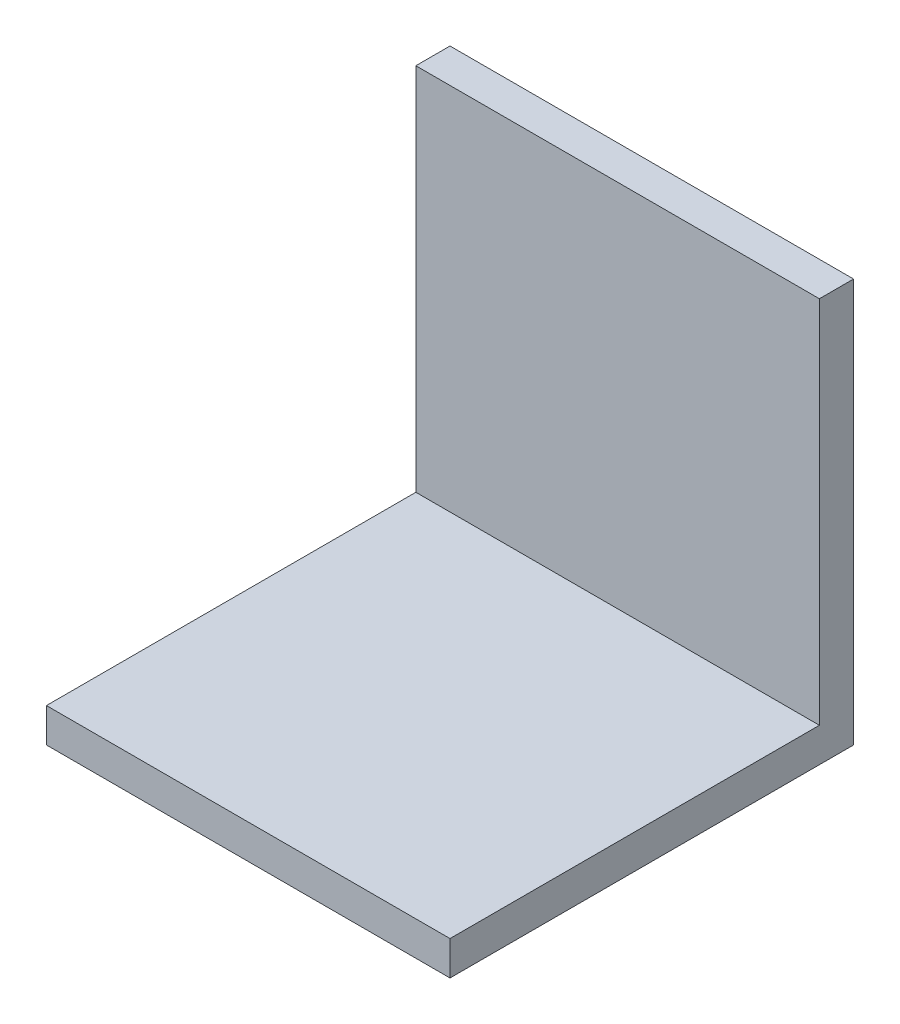
ISO-10303-21;
HEADER;
FILE_DESCRIPTION(('STEP AP214'),'2;1');
FILE_NAME('part.step','',(''),(''),'','','');
FILE_SCHEMA(('AUTOMOTIVE_DESIGN { 1 0 10303 214 1 1 1 1 }'));
ENDSEC;
DATA;
#1=APPLICATION_CONTEXT('core data for automotive mechanical design processes');
#2=APPLICATION_PROTOCOL_DEFINITION('international standard','automotive_design',2000,#1);
#3=PRODUCT_CONTEXT('',#1,'mechanical');
#4=PRODUCT('Part','Part','',(#3));
#5=PRODUCT_RELATED_PRODUCT_CATEGORY('part','',(#4));
#6=PRODUCT_DEFINITION_FORMATION('','',#4);
#7=PRODUCT_DEFINITION_CONTEXT('part definition',#1,'design');
#8=PRODUCT_DEFINITION('design','',#6,#7);
#9=PRODUCT_DEFINITION_SHAPE('','',#8);
#10=(LENGTH_UNIT() NAMED_UNIT(*) SI_UNIT(.MILLI.,.METRE.));
#11=(NAMED_UNIT(*) PLANE_ANGLE_UNIT() SI_UNIT($,.RADIAN.));
#12=(NAMED_UNIT(*) SI_UNIT($,.STERADIAN.) SOLID_ANGLE_UNIT());
#13=UNCERTAINTY_MEASURE_WITH_UNIT(LENGTH_MEASURE(1.E-05),#10,'distance_accuracy_value','');
#14=(GEOMETRIC_REPRESENTATION_CONTEXT(3) GLOBAL_UNCERTAINTY_ASSIGNED_CONTEXT((#13)) GLOBAL_UNIT_ASSIGNED_CONTEXT((#10,
#11,#12)) REPRESENTATION_CONTEXT('',''));
#15=CARTESIAN_POINT('',(0.,0.,0.));
#16=DIRECTION('',(0.,0.,1.));
#17=DIRECTION('',(1.,0.,0.));
#18=AXIS2_PLACEMENT_3D('',#15,#16,#17);
#19=CARTESIAN_POINT('',(0.,5.08,0.));
#20=DIRECTION('',(1.,0.,0.));
#21=DIRECTION('',(0.,0.,-1.));
#22=AXIS2_PLACEMENT_3D('',#19,#20,#21);
#23=PLANE('',#22);
#24=DIRECTION('',(0.,0.,1.));
#25=VECTOR('',#24,1.);
#26=CARTESIAN_POINT('',(0.,5.08,0.));
#27=LINE('',#26,#25);
#28=CARTESIAN_POINT('',(0.,5.08,-54.92));
#29=VERTEX_POINT('',#28);
#30=CARTESIAN_POINT('',(0.,5.08,0.));
#31=VERTEX_POINT('',#30);
#32=EDGE_CURVE('E97',#29,#31,#27,.T.);
#33=ORIENTED_EDGE('',*,*,#32,.F.);
#34=DIRECTION('',(0.,1.,0.));
#35=VECTOR('',#34,1.);
#36=CARTESIAN_POINT('',(0.,0.,-54.92));
#37=LINE('',#36,#35);
#38=CARTESIAN_POINT('',(0.,60.,-54.92));
#39=VERTEX_POINT('',#38);
#40=EDGE_CURVE('E91',#29,#39,#37,.T.);
#41=ORIENTED_EDGE('',*,*,#40,.T.);
#42=DIRECTION('',(0.,0.,-1.));
#43=VECTOR('',#42,1.);
#44=CARTESIAN_POINT('',(0.,60.,-54.92));
#45=LINE('',#44,#43);
#46=CARTESIAN_POINT('',(0.,60.,-60.));
#47=VERTEX_POINT('',#46);
#48=EDGE_CURVE('E94',#39,#47,#45,.T.);
#49=ORIENTED_EDGE('',*,*,#48,.T.);
#50=DIRECTION('',(0.,-1.,0.));
#51=VECTOR('',#50,1.);
#52=CARTESIAN_POINT('',(0.,5.08,-60.));
#53=LINE('',#52,#51);
#54=CARTESIAN_POINT('',(0.,0.,-60.));
#55=VERTEX_POINT('',#54);
#56=EDGE_CURVE('E126',#47,#55,#53,.T.);
#57=ORIENTED_EDGE('',*,*,#56,.T.);
#58=DIRECTION('',(0.,0.,1.));
#59=VECTOR('',#58,1.);
#60=CARTESIAN_POINT('',(0.,0.,0.));
#61=LINE('',#60,#59);
#62=CARTESIAN_POINT('',(0.,0.,0.));
#63=VERTEX_POINT('',#62);
#64=EDGE_CURVE('E120',#55,#63,#61,.T.);
#65=ORIENTED_EDGE('',*,*,#64,.T.);
#66=DIRECTION('',(0.,-1.,0.));
#67=VECTOR('',#66,1.);
#68=CARTESIAN_POINT('',(0.,5.08,0.));
#69=LINE('',#68,#67);
#70=EDGE_CURVE('E11',#31,#63,#69,.T.);
#71=ORIENTED_EDGE('',*,*,#70,.F.);
#72=EDGE_LOOP('',(#33,#41,#49,#57,#65,#71));
#73=FACE_BOUND('',#72,.T.);
#74=ADVANCED_FACE('F41',(#73),#23,.F.);
#75=CARTESIAN_POINT('',(0.,5.08,0.));
#76=DIRECTION('',(0.,0.,-1.));
#77=DIRECTION('',(-1.,0.,0.));
#78=AXIS2_PLACEMENT_3D('',#75,#76,#77);
#79=PLANE('',#78);
#80=DIRECTION('',(1.,0.,0.));
#81=VECTOR('',#80,1.);
#82=CARTESIAN_POINT('',(0.,0.,0.));
#83=LINE('',#82,#81);
#84=CARTESIAN_POINT('',(60.,0.,0.));
#85=VERTEX_POINT('',#84);
#86=EDGE_CURVE('E128',#63,#85,#83,.T.);
#87=ORIENTED_EDGE('',*,*,#86,.T.);
#88=DIRECTION('',(0.,-1.,0.));
#89=VECTOR('',#88,1.);
#90=CARTESIAN_POINT('',(60.,5.08,0.));
#91=LINE('',#90,#89);
#92=CARTESIAN_POINT('',(60.,5.08,0.));
#93=VERTEX_POINT('',#92);
#94=EDGE_CURVE('E48',#93,#85,#91,.T.);
#95=ORIENTED_EDGE('',*,*,#94,.F.);
#96=DIRECTION('',(1.,0.,0.));
#97=VECTOR('',#96,1.);
#98=CARTESIAN_POINT('',(0.,5.08,0.));
#99=LINE('',#98,#97);
#100=EDGE_CURVE('E122',#31,#93,#99,.T.);
#101=ORIENTED_EDGE('',*,*,#100,.F.);
#102=ORIENTED_EDGE('',*,*,#70,.T.);
#103=EDGE_LOOP('',(#87,#95,#101,#102));
#104=FACE_BOUND('',#103,.T.);
#105=ADVANCED_FACE('F150',(#104),#79,.F.);
#106=CARTESIAN_POINT('',(60.,5.08,0.));
#107=DIRECTION('',(-1.,0.,0.));
#108=DIRECTION('',(0.,0.,1.));
#109=AXIS2_PLACEMENT_3D('',#106,#107,#108);
#110=PLANE('',#109);
#111=DIRECTION('',(0.,0.,-1.));
#112=VECTOR('',#111,1.);
#113=CARTESIAN_POINT('',(60.,0.,0.));
#114=LINE('',#113,#112);
#115=CARTESIAN_POINT('',(60.,0.,-60.));
#116=VERTEX_POINT('',#115);
#117=EDGE_CURVE('E130',#85,#116,#114,.T.);
#118=ORIENTED_EDGE('',*,*,#117,.T.);
#119=DIRECTION('',(0.,-1.,0.));
#120=VECTOR('',#119,1.);
#121=CARTESIAN_POINT('',(60.,5.08,-60.));
#122=LINE('',#121,#120);
#123=CARTESIAN_POINT('',(60.,60.,-60.));
#124=VERTEX_POINT('',#123);
#125=EDGE_CURVE('E134',#124,#116,#122,.T.);
#126=ORIENTED_EDGE('',*,*,#125,.F.);
#127=DIRECTION('',(0.,0.,-1.));
#128=VECTOR('',#127,1.);
#129=CARTESIAN_POINT('',(60.,60.,-54.92));
#130=LINE('',#129,#128);
#131=CARTESIAN_POINT('',(60.,60.,-54.92));
#132=VERTEX_POINT('',#131);
#133=EDGE_CURVE('E109',#132,#124,#130,.T.);
#134=ORIENTED_EDGE('',*,*,#133,.F.);
#135=DIRECTION('',(0.,-1.,0.));
#136=VECTOR('',#135,1.);
#137=CARTESIAN_POINT('',(60.,0.,-54.92));
#138=LINE('',#137,#136);
#139=CARTESIAN_POINT('',(60.,5.08,-54.92));
#140=VERTEX_POINT('',#139);
#141=EDGE_CURVE('E101',#132,#140,#138,.T.);
#142=ORIENTED_EDGE('',*,*,#141,.T.);
#143=DIRECTION('',(0.,0.,-1.));
#144=VECTOR('',#143,1.);
#145=CARTESIAN_POINT('',(60.,5.08,0.));
#146=LINE('',#145,#144);
#147=EDGE_CURVE('E55',#93,#140,#146,.T.);
#148=ORIENTED_EDGE('',*,*,#147,.F.);
#149=ORIENTED_EDGE('',*,*,#94,.T.);
#150=EDGE_LOOP('',(#118,#126,#134,#142,#148,#149));
#151=FACE_BOUND('',#150,.T.);
#152=ADVANCED_FACE('F140',(#151),#110,.F.);
#153=CARTESIAN_POINT('',(0.,5.08,-60.));
#154=DIRECTION('',(0.,0.,1.));
#155=DIRECTION('',(1.,0.,0.));
#156=AXIS2_PLACEMENT_3D('',#153,#154,#155);
#157=PLANE('',#156);
#158=DIRECTION('',(-1.,0.,0.));
#159=VECTOR('',#158,1.);
#160=CARTESIAN_POINT('',(0.,0.,-60.));
#161=LINE('',#160,#159);
#162=EDGE_CURVE('E123',#116,#55,#161,.T.);
#163=ORIENTED_EDGE('',*,*,#162,.T.);
#164=ORIENTED_EDGE('',*,*,#56,.F.);
#165=DIRECTION('',(1.,0.,0.));
#166=VECTOR('',#165,1.);
#167=CARTESIAN_POINT('',(60.,60.,-60.));
#168=LINE('',#167,#166);
#169=EDGE_CURVE('E108',#47,#124,#168,.T.);
#170=ORIENTED_EDGE('',*,*,#169,.T.);
#171=ORIENTED_EDGE('',*,*,#125,.T.);
#172=EDGE_LOOP('',(#163,#164,#170,#171));
#173=FACE_BOUND('',#172,.T.);
#174=ADVANCED_FACE('F149',(#173),#157,.F.);
#175=CARTESIAN_POINT('',(0.,5.08,0.));
#176=DIRECTION('',(0.,-1.,0.));
#177=DIRECTION('',(0.,0.,-1.));
#178=AXIS2_PLACEMENT_3D('',#175,#176,#177);
#179=PLANE('',#178);
#180=ORIENTED_EDGE('',*,*,#147,.T.);
#181=DIRECTION('',(-1.,0.,0.));
#182=VECTOR('',#181,1.);
#183=CARTESIAN_POINT('',(0.,5.08,-54.92));
#184=LINE('',#183,#182);
#185=EDGE_CURVE('E59',#140,#29,#184,.T.);
#186=ORIENTED_EDGE('',*,*,#185,.T.);
#187=ORIENTED_EDGE('',*,*,#32,.T.);
#188=ORIENTED_EDGE('',*,*,#100,.T.);
#189=EDGE_LOOP('',(#180,#186,#187,#188));
#190=FACE_BOUND('',#189,.T.);
#191=ADVANCED_FACE('F151',(#190),#179,.F.);
#192=CARTESIAN_POINT('',(0.,0.,0.));
#193=DIRECTION('',(0.,-1.,0.));
#194=DIRECTION('',(0.,0.,-1.));
#195=AXIS2_PLACEMENT_3D('',#192,#193,#194);
#196=PLANE('',#195);
#197=ORIENTED_EDGE('',*,*,#86,.F.);
#198=ORIENTED_EDGE('',*,*,#64,.F.);
#199=ORIENTED_EDGE('',*,*,#162,.F.);
#200=ORIENTED_EDGE('',*,*,#117,.F.);
#201=EDGE_LOOP('',(#197,#198,#199,#200));
#202=FACE_BOUND('',#201,.T.);
#203=ADVANCED_FACE('F146',(#202),#196,.T.);
#204=CARTESIAN_POINT('',(0.,0.,-54.92));
#205=DIRECTION('',(0.,0.,1.));
#206=DIRECTION('',(1.,0.,0.));
#207=AXIS2_PLACEMENT_3D('',#204,#205,#206);
#208=PLANE('',#207);
#209=ORIENTED_EDGE('',*,*,#185,.F.);
#210=ORIENTED_EDGE('',*,*,#141,.F.);
#211=DIRECTION('',(1.,0.,0.));
#212=VECTOR('',#211,1.);
#213=CARTESIAN_POINT('',(60.,60.,-54.92));
#214=LINE('',#213,#212);
#215=EDGE_CURVE('E100',#39,#132,#214,.T.);
#216=ORIENTED_EDGE('',*,*,#215,.F.);
#217=ORIENTED_EDGE('',*,*,#40,.F.);
#218=EDGE_LOOP('',(#209,#210,#216,#217));
#219=FACE_BOUND('',#218,.T.);
#220=ADVANCED_FACE('F112',(#219),#208,.T.);
#221=CARTESIAN_POINT('',(60.,60.,-54.92));
#222=DIRECTION('',(0.,1.,0.));
#223=DIRECTION('',(0.,0.,1.));
#224=AXIS2_PLACEMENT_3D('',#221,#222,#223);
#225=PLANE('',#224);
#226=ORIENTED_EDGE('',*,*,#169,.F.);
#227=ORIENTED_EDGE('',*,*,#48,.F.);
#228=ORIENTED_EDGE('',*,*,#215,.T.);
#229=ORIENTED_EDGE('',*,*,#133,.T.);
#230=EDGE_LOOP('',(#226,#227,#228,#229));
#231=FACE_BOUND('',#230,.T.);
#232=ADVANCED_FACE('F105',(#231),#225,.T.);
#233=CLOSED_SHELL('',(#74,#105,#152,#174,#191,#203,#220,#232));
#234=MANIFOLD_SOLID_BREP('B2',#233);
#235=ADVANCED_BREP_SHAPE_REPRESENTATION('',(#18,#234),#14);
#236=SHAPE_DEFINITION_REPRESENTATION(#9,#235);
ENDSEC;
END-ISO-10303-21;
